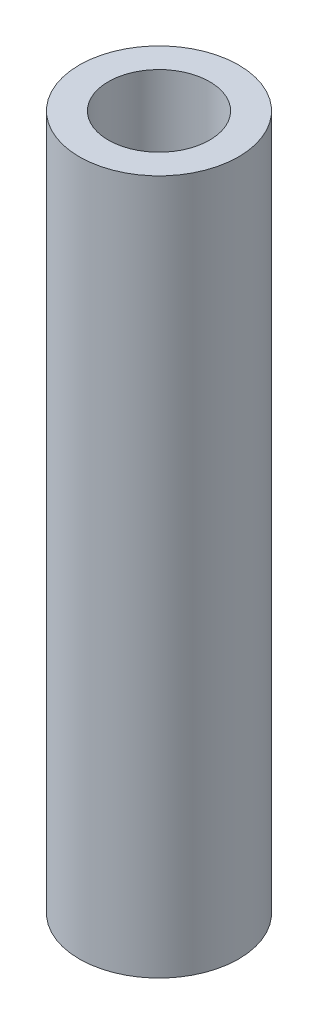
ISO-10303-21;
HEADER;
FILE_DESCRIPTION(('STEP AP214'),'2;1');
FILE_NAME('part.step','',(''),(''),'','','');
FILE_SCHEMA(('AUTOMOTIVE_DESIGN { 1 0 10303 214 1 1 1 1 }'));
ENDSEC;
DATA;
#1=APPLICATION_CONTEXT('core data for automotive mechanical design processes');
#2=APPLICATION_PROTOCOL_DEFINITION('international standard','automotive_design',2000,#1);
#3=PRODUCT_CONTEXT('',#1,'mechanical');
#4=PRODUCT('Part','Part','',(#3));
#5=PRODUCT_RELATED_PRODUCT_CATEGORY('part','',(#4));
#6=PRODUCT_DEFINITION_FORMATION('','',#4);
#7=PRODUCT_DEFINITION_CONTEXT('part definition',#1,'design');
#8=PRODUCT_DEFINITION('design','',#6,#7);
#9=PRODUCT_DEFINITION_SHAPE('','',#8);
#10=(LENGTH_UNIT() NAMED_UNIT(*) SI_UNIT(.MILLI.,.METRE.));
#11=(NAMED_UNIT(*) PLANE_ANGLE_UNIT() SI_UNIT($,.RADIAN.));
#12=(NAMED_UNIT(*) SI_UNIT($,.STERADIAN.) SOLID_ANGLE_UNIT());
#13=UNCERTAINTY_MEASURE_WITH_UNIT(LENGTH_MEASURE(1.E-05),#10,'distance_accuracy_value','');
#14=(GEOMETRIC_REPRESENTATION_CONTEXT(3) GLOBAL_UNCERTAINTY_ASSIGNED_CONTEXT((#13)) GLOBAL_UNIT_ASSIGNED_CONTEXT((#10,
#11,#12)) REPRESENTATION_CONTEXT('',''));
#15=CARTESIAN_POINT('',(0.,0.,0.));
#16=DIRECTION('',(0.,0.,1.));
#17=DIRECTION('',(1.,0.,0.));
#18=AXIS2_PLACEMENT_3D('',#15,#16,#17);
#19=CARTESIAN_POINT('',(0.,24.,0.));
#20=DIRECTION('',(0.,1.,0.));
#21=DIRECTION('',(0.,0.,1.));
#22=AXIS2_PLACEMENT_3D('',#19,#20,#21);
#23=PLANE('',#22);
#24=CARTESIAN_POINT('',(0.,24.,0.));
#25=DIRECTION('',(0.,1.,0.));
#26=DIRECTION('',(0.,0.,1.));
#27=AXIS2_PLACEMENT_3D('',#24,#25,#26);
#28=CIRCLE('',#27,2.75);
#29=CARTESIAN_POINT('',(0.,24.,2.75));
#30=VERTEX_POINT('',#29);
#31=EDGE_CURVE('E10',#30,#30,#28,.T.);
#32=ORIENTED_EDGE('',*,*,#31,.T.);
#33=EDGE_LOOP('',(#32));
#34=FACE_BOUND('',#33,.T.);
#35=CARTESIAN_POINT('',(0.,24.,0.));
#36=DIRECTION('',(0.,1.,0.));
#37=DIRECTION('',(0.,0.,1.));
#38=AXIS2_PLACEMENT_3D('',#35,#36,#37);
#39=CIRCLE('',#38,1.75);
#40=CARTESIAN_POINT('',(0.,24.,1.75));
#41=VERTEX_POINT('',#40);
#42=EDGE_CURVE('E50',#41,#41,#39,.T.);
#43=ORIENTED_EDGE('',*,*,#42,.F.);
#44=EDGE_LOOP('',(#43));
#45=FACE_BOUND('',#44,.T.);
#46=ADVANCED_FACE('F36',(#34,#45),#23,.T.);
#47=CARTESIAN_POINT('',(0.,0.,0.));
#48=DIRECTION('',(0.,1.,0.));
#49=DIRECTION('',(0.,0.,1.));
#50=AXIS2_PLACEMENT_3D('',#47,#48,#49);
#51=PLANE('',#50);
#52=CARTESIAN_POINT('',(0.,0.,0.));
#53=DIRECTION('',(0.,1.,0.));
#54=DIRECTION('',(0.,0.,1.));
#55=AXIS2_PLACEMENT_3D('',#52,#53,#54);
#56=CIRCLE('',#55,2.75);
#57=CARTESIAN_POINT('',(0.,0.,2.75));
#58=VERTEX_POINT('',#57);
#59=EDGE_CURVE('E40',#58,#58,#56,.T.);
#60=ORIENTED_EDGE('',*,*,#59,.F.);
#61=EDGE_LOOP('',(#60));
#62=FACE_BOUND('',#61,.T.);
#63=CARTESIAN_POINT('',(0.,0.,0.));
#64=DIRECTION('',(0.,1.,0.));
#65=DIRECTION('',(0.,0.,1.));
#66=AXIS2_PLACEMENT_3D('',#63,#64,#65);
#67=CIRCLE('',#66,1.75);
#68=CARTESIAN_POINT('',(0.,0.,1.75));
#69=VERTEX_POINT('',#68);
#70=EDGE_CURVE('E52',#69,#69,#67,.T.);
#71=ORIENTED_EDGE('',*,*,#70,.T.);
#72=EDGE_LOOP('',(#71));
#73=FACE_BOUND('',#72,.T.);
#74=ADVANCED_FACE('F63',(#62,#73),#51,.F.);
#75=CARTESIAN_POINT('',(0.,24.,0.));
#76=DIRECTION('',(0.,-1.,0.));
#77=DIRECTION('',(0.,0.,-1.));
#78=AXIS2_PLACEMENT_3D('',#75,#76,#77);
#79=CYLINDRICAL_SURFACE('',#78,2.75);
#80=ORIENTED_EDGE('',*,*,#31,.F.);
#81=EDGE_LOOP('',(#80));
#82=FACE_BOUND('',#81,.T.);
#83=ORIENTED_EDGE('',*,*,#59,.T.);
#84=EDGE_LOOP('',(#83));
#85=FACE_BOUND('',#84,.T.);
#86=ADVANCED_FACE('F38',(#82,#85),#79,.T.);
#87=CARTESIAN_POINT('',(0.,24.,0.));
#88=DIRECTION('',(0.,-1.,0.));
#89=DIRECTION('',(0.,0.,-1.));
#90=AXIS2_PLACEMENT_3D('',#87,#88,#89);
#91=CYLINDRICAL_SURFACE('',#90,1.75);
#92=ORIENTED_EDGE('',*,*,#42,.T.);
#93=EDGE_LOOP('',(#92));
#94=FACE_BOUND('',#93,.T.);
#95=ORIENTED_EDGE('',*,*,#70,.F.);
#96=EDGE_LOOP('',(#95));
#97=FACE_BOUND('',#96,.T.);
#98=ADVANCED_FACE('F59',(#94,#97),#91,.F.);
#99=CLOSED_SHELL('',(#46,#74,#86,#98));
#100=MANIFOLD_SOLID_BREP('B2',#99);
#101=ADVANCED_BREP_SHAPE_REPRESENTATION('',(#18,#100),#14);
#102=SHAPE_DEFINITION_REPRESENTATION(#9,#101);
ENDSEC;
END-ISO-10303-21;
